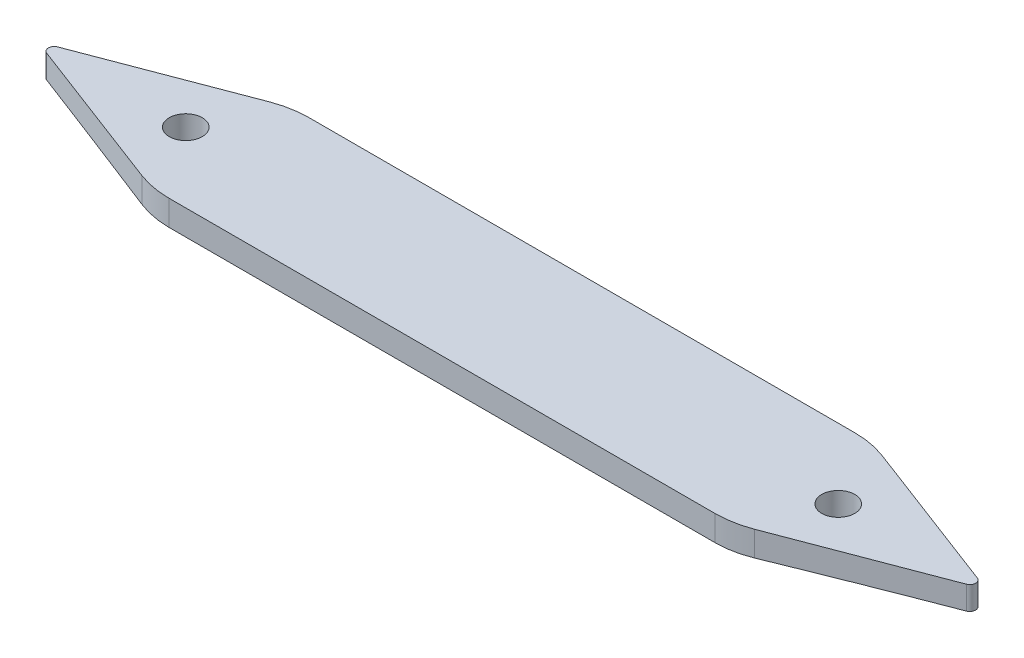
ISO-10303-21;
HEADER;
FILE_DESCRIPTION(('STEP AP214'),'2;1');
FILE_NAME('part.step','',(''),(''),'','','');
FILE_SCHEMA(('AUTOMOTIVE_DESIGN { 1 0 10303 214 1 1 1 1 }'));
ENDSEC;
DATA;
#1=APPLICATION_CONTEXT('core data for automotive mechanical design processes');
#2=APPLICATION_PROTOCOL_DEFINITION('international standard','automotive_design',2000,#1);
#3=PRODUCT_CONTEXT('',#1,'mechanical');
#4=PRODUCT('Part','Part','',(#3));
#5=PRODUCT_RELATED_PRODUCT_CATEGORY('part','',(#4));
#6=PRODUCT_DEFINITION_FORMATION('','',#4);
#7=PRODUCT_DEFINITION_CONTEXT('part definition',#1,'design');
#8=PRODUCT_DEFINITION('design','',#6,#7);
#9=PRODUCT_DEFINITION_SHAPE('','',#8);
#10=(LENGTH_UNIT() NAMED_UNIT(*) SI_UNIT(.MILLI.,.METRE.));
#11=(NAMED_UNIT(*) PLANE_ANGLE_UNIT() SI_UNIT($,.RADIAN.));
#12=(NAMED_UNIT(*) SI_UNIT($,.STERADIAN.) SOLID_ANGLE_UNIT());
#13=UNCERTAINTY_MEASURE_WITH_UNIT(LENGTH_MEASURE(1.E-05),#10,'distance_accuracy_value','');
#14=(GEOMETRIC_REPRESENTATION_CONTEXT(3) GLOBAL_UNCERTAINTY_ASSIGNED_CONTEXT((#13)) GLOBAL_UNIT_ASSIGNED_CONTEXT((#10,
#11,#12)) REPRESENTATION_CONTEXT('',''));
#15=CARTESIAN_POINT('',(0.,0.,0.));
#16=DIRECTION('',(0.,0.,1.));
#17=DIRECTION('',(1.,0.,0.));
#18=AXIS2_PLACEMENT_3D('',#15,#16,#17);
#19=CARTESIAN_POINT('',(-62.3678648511801,-10.,0.));
#20=DIRECTION('',(0.,1.,0.));
#21=DIRECTION('',(0.,0.,1.));
#22=AXIS2_PLACEMENT_3D('',#19,#20,#21);
#23=CYLINDRICAL_SURFACE('',#22,0.793750000000001);
#24=DIRECTION('',(0.,1.,0.));
#25=VECTOR('',#24,1.);
#26=CARTESIAN_POINT('',(-62.6498189486751,-10.,0.741984467092001));
#27=LINE('',#26,#25);
#28=CARTESIAN_POINT('',(-62.6498189486751,-0.00163461129128704,0.741984467092001));
#29=VERTEX_POINT('',#28);
#30=CARTESIAN_POINT('',(-62.6498189486751,3.175,0.741984467092001));
#31=VERTEX_POINT('',#30);
#32=EDGE_CURVE('E142',#29,#31,#27,.T.);
#33=ORIENTED_EDGE('',*,*,#32,.T.);
#34=CARTESIAN_POINT('',(-62.3678648511801,3.175,0.));
#35=DIRECTION('',(0.,1.,0.));
#36=DIRECTION('',(0.,0.,1.));
#37=AXIS2_PLACEMENT_3D('',#34,#35,#36);
#38=CIRCLE('',#37,0.793750000000001);
#39=CARTESIAN_POINT('',(-62.6498189486751,3.175,-0.741984467092001));
#40=VERTEX_POINT('',#39);
#41=EDGE_CURVE('E50',#31,#40,#38,.F.);
#42=ORIENTED_EDGE('',*,*,#41,.T.);
#43=DIRECTION('',(0.,1.,0.));
#44=VECTOR('',#43,1.);
#45=CARTESIAN_POINT('',(-62.6498189486751,-10.,-0.741984467092001));
#46=LINE('',#45,#44);
#47=CARTESIAN_POINT('',(-62.6498189486751,-0.00163461129125929,-0.741984467092001));
#48=VERTEX_POINT('',#47);
#49=EDGE_CURVE('E42',#48,#40,#46,.T.);
#50=ORIENTED_EDGE('',*,*,#49,.F.);
#51=CARTESIAN_POINT('',(-62.6498189486751,-0.00163461129129572,-0.741984467092001));
#52=CARTESIAN_POINT('',(-62.6915741219466,-0.00156508989525228,-0.726158063315236));
#53=CARTESIAN_POINT('',(-62.7319540446865,-0.00148155707035045,-0.706744537786753));
#54=CARTESIAN_POINT('',(-62.8088737758457,-0.00129747886939431,-0.661456213203216));
#55=CARTESIAN_POINT('',(-62.8454163621534,-0.00119694593945092,-0.635586134570223));
#56=CARTESIAN_POINT('',(-62.9136515843527,-0.00098969656053813,-0.578059238876378));
#57=CARTESIAN_POINT('',(-62.9453419646321,-0.000882977267342816,-0.546399745444655));
#58=CARTESIAN_POINT('',(-63.0029529930304,-0.000675561471225153,-0.478218111195962));
#59=CARTESIAN_POINT('',(-63.0288747805474,-0.000574863781809217,-0.441696932928466));
#60=CARTESIAN_POINT('',(-63.0742198858723,-0.000390787216427163,-0.36481984003851));
#61=CARTESIAN_POINT('',(-63.0936430437366,-0.000307408766739843,-0.324463831064908));
#62=CARTESIAN_POINT('',(-63.125441558766,-0.000167369911612684,-0.241057601110135));
#63=CARTESIAN_POINT('',(-63.1378158399757,-0.00011071358532191,-0.198006969928573));
#64=CARTESIAN_POINT('',(-63.1551600375871,-3.05267496641538E-05,-0.110441728920832));
#65=CARTESIAN_POINT('',(-63.1601303884779,-6.99429647416766E-06,-0.0659272051578151));
#66=CARTESIAN_POINT('',(-63.1625269602261,4.29703752498706E-06,0.0233021506023194));
#67=CARTESIAN_POINT('',(-63.159953570562,-7.94223479437769E-06,0.0680169721391791));
#68=CARTESIAN_POINT('',(-63.1473362532705,-6.68119844042359E-05,0.15638230282722));
#69=CARTESIAN_POINT('',(-63.1372919278762,-0.000113444292844494,0.200032755181551));
#70=CARTESIAN_POINT('',(-63.1100182199976,-0.000235840348066786,0.285024774146865));
#71=CARTESIAN_POINT('',(-63.0927893366819,-0.000311602070967512,0.3263665009372));
#72=CARTESIAN_POINT('',(-63.0516403628097,-0.000483699055612537,0.40556284544066));
#73=CARTESIAN_POINT('',(-63.0277215993205,-0.000580030236110841,0.443418152774899));
#74=CARTESIAN_POINT('',(-62.9738548715119,-0.000782468520473837,0.514594482151192));
#75=CARTESIAN_POINT('',(-62.9439040425362,-0.000888580256135629,0.547913337162356));
#76=CARTESIAN_POINT('',(-62.878812249009,-0.00109865913856934,0.609072578464356));
#77=CARTESIAN_POINT('',(-62.8436669514175,-0.001202624411518,0.636908345297608));
#78=CARTESIAN_POINT('',(-62.7692513136541,-0.00139636974883372,0.686230536853314));
#79=CARTESIAN_POINT('',(-62.7299899315296,-0.00148617959541336,0.707730377249736));
#80=CARTESIAN_POINT('',(-62.6762519654495,-0.00158879578078354,0.73153329892461));
#81=CARTESIAN_POINT('',(-62.6631005574963,-0.00161239795515977,0.736940088182253));
#82=CARTESIAN_POINT('',(-62.6498189486751,-0.00163461129127525,0.741984467091999));
#83=B_SPLINE_CURVE_WITH_KNOTS('',3,(#51,#52,#53,#54,#55,#56,#57,#58,#59,#60,#61,#62,#63,#64,#65,
#66,#67,#68,#69,#70,#71,#72,#73,#74,#75,#76,#77,#78,#79,#80,#81,#82),.UNSPECIFIED.,.F.,.F.,(4,2,
2,2,2,2,2,2,2,2,2,2,2,2,2,4),(0.,0.133783822944755,0.267470120852814,0.401218377148128,
0.534940192327704,0.668665298415121,0.802410811123229,0.936148474856556,1.06987923392123,
1.20361711357643,1.33734570294199,1.47104778344296,1.60481351005397,1.73869145567992,
1.87228385745369,1.91491974103122),.UNSPECIFIED.);
#84=EDGE_CURVE('E146',#48,#29,#83,.T.);
#85=ORIENTED_EDGE('',*,*,#84,.T.);
#86=EDGE_LOOP('',(#33,#42,#50,#85));
#87=FACE_BOUND('',#86,.T.);
#88=ADVANCED_FACE('F33',(#87),#23,.T.);
#89=CARTESIAN_POINT('',(-37.2049560035451,-10.,3.17500000000001));
#90=DIRECTION('',(0.,1.,0.));
#91=DIRECTION('',(0.,0.,1.));
#92=AXIS2_PLACEMENT_3D('',#89,#90,#91);
#93=CYLINDRICAL_SURFACE('',#92,12.7);
#94=DIRECTION('',(0.,1.,0.));
#95=VECTOR('',#94,1.);
#96=CARTESIAN_POINT('',(-41.7162215634645,-10.,-8.69675147347203));
#97=LINE('',#96,#95);
#98=CARTESIAN_POINT('',(-41.7162215634645,-0.22471224149001,-8.69675147347203));
#99=VERTEX_POINT('',#98);
#100=CARTESIAN_POINT('',(-41.7162215634645,3.175,-8.69675147347203));
#101=VERTEX_POINT('',#100);
#102=EDGE_CURVE('E200',#99,#101,#97,.T.);
#103=ORIENTED_EDGE('',*,*,#102,.T.);
#104=CARTESIAN_POINT('',(-37.2049560035451,3.175,3.17500000000001));
#105=DIRECTION('',(0.,1.,0.));
#106=DIRECTION('',(0.,0.,1.));
#107=AXIS2_PLACEMENT_3D('',#104,#105,#106);
#108=CIRCLE('',#107,12.7);
#109=CARTESIAN_POINT('',(-37.2049560035451,3.175,-9.525));
#110=VERTEX_POINT('',#109);
#111=EDGE_CURVE('E246',#101,#110,#108,.F.);
#112=ORIENTED_EDGE('',*,*,#111,.T.);
#113=DIRECTION('',(0.,1.,0.));
#114=VECTOR('',#113,1.);
#115=CARTESIAN_POINT('',(-37.2049560035451,-10.,-9.52499999999999));
#116=LINE('',#115,#114);
#117=CARTESIAN_POINT('',(-37.2049560035451,-0.269587958181022,-9.52500000000001));
#118=VERTEX_POINT('',#117);
#119=EDGE_CURVE('E203',#118,#110,#116,.T.);
#120=ORIENTED_EDGE('',*,*,#119,.F.);
#121=CARTESIAN_POINT('',(-37.2049560035451,-0.269587958180995,-9.525));
#122=CARTESIAN_POINT('',(-37.3979412096529,-0.269588539962104,-9.52500038932654));
#123=CARTESIAN_POINT('',(-37.590901687739,-0.269338658257018,-9.52060058943539));
#124=CARTESIAN_POINT('',(-37.9764192947636,-0.268343613325888,-9.503015716948));
#125=CARTESIAN_POINT('',(-38.1689764264833,-0.267598453526247,-9.48983070512908));
#126=CARTESIAN_POINT('',(-38.7422700961615,-0.264645240343936,-9.43741717424379));
#127=CARTESIAN_POINT('',(-39.1219001718408,-0.261719202526182,-9.38532840618097));
#128=CARTESIAN_POINT('',(-39.8748848942764,-0.254059366661241,-9.24707731345254));
#129=CARTESIAN_POINT('',(-40.2482395495386,-0.249325571064576,-9.16091503497556));
#130=CARTESIAN_POINT('',(-40.8027098721836,-0.240995926584404,-9.00627383709047));
#131=CARTESIAN_POINT('',(-40.9873708969754,-0.237999325829147,-8.95020374637864));
#132=CARTESIAN_POINT('',(-41.3539426171255,-0.231629868310424,-8.82971275025547));
#133=CARTESIAN_POINT('',(-41.5358532980001,-0.228257009566296,-8.76529180088406));
#134=CARTESIAN_POINT('',(-41.7162215634645,-0.224712241490016,-8.69675147347203));
#135=B_SPLINE_CURVE_WITH_KNOTS('',3,(#121,#122,#123,#124,#125,#126,#127,#128,#129,#130,#131,
#132,#133,#134),.UNSPECIFIED.,.F.,.F.,(4,2,2,2,2,2,4),(0.,0.578855974469045,1.1577079443725,
2.30563518188885,3.45356086332791,4.03241225481911,4.61126669358702),.UNSPECIFIED.);
#136=EDGE_CURVE('E192',#118,#99,#135,.T.);
#137=ORIENTED_EDGE('',*,*,#136,.T.);
#138=EDGE_LOOP('',(#103,#112,#120,#137));
#139=FACE_BOUND('',#138,.T.);
#140=ADVANCED_FACE('F178',(#139),#93,.T.);
#141=CARTESIAN_POINT('',(37.2049560035452,-10.,-9.525));
#142=DIRECTION('',(0.,0.,-1.));
#143=DIRECTION('',(-1.,0.,0.));
#144=AXIS2_PLACEMENT_3D('',#141,#142,#143);
#145=PLANE('',#144);
#146=ORIENTED_EDGE('',*,*,#119,.T.);
#147=DIRECTION('',(1.,0.,0.));
#148=VECTOR('',#147,1.);
#149=CARTESIAN_POINT('',(37.2049560035452,3.175,-9.525));
#150=LINE('',#149,#148);
#151=CARTESIAN_POINT('',(37.2049560035452,3.175,-9.525));
#152=VERTEX_POINT('',#151);
#153=EDGE_CURVE('E255',#110,#152,#150,.T.);
#154=ORIENTED_EDGE('',*,*,#153,.T.);
#155=DIRECTION('',(0.,1.,0.));
#156=VECTOR('',#155,1.);
#157=CARTESIAN_POINT('',(37.2049560035452,-10.,-9.525));
#158=LINE('',#157,#156);
#159=CARTESIAN_POINT('',(37.2049560035452,-0.269587958180995,-9.525));
#160=VERTEX_POINT('',#159);
#161=EDGE_CURVE('E206',#160,#152,#158,.T.);
#162=ORIENTED_EDGE('',*,*,#161,.F.);
#163=DIRECTION('',(-1.,0.,0.));
#164=VECTOR('',#163,1.);
#165=CARTESIAN_POINT('',(94.675,-0.269587958181022,-9.52500000000001));
#166=LINE('',#165,#164);
#167=EDGE_CURVE('E310',#160,#118,#166,.T.);
#168=ORIENTED_EDGE('',*,*,#167,.T.);
#169=EDGE_LOOP('',(#146,#154,#162,#168));
#170=FACE_BOUND('',#169,.T.);
#171=ADVANCED_FACE('F183',(#170),#145,.T.);
#172=CARTESIAN_POINT('',(37.2049560035452,-10.,3.17500000000002));
#173=DIRECTION('',(0.,1.,0.));
#174=DIRECTION('',(0.,0.,1.));
#175=AXIS2_PLACEMENT_3D('',#172,#173,#174);
#176=CYLINDRICAL_SURFACE('',#175,12.7);
#177=ORIENTED_EDGE('',*,*,#161,.T.);
#178=CARTESIAN_POINT('',(37.2049560035452,3.175,3.17500000000002));
#179=DIRECTION('',(0.,1.,0.));
#180=DIRECTION('',(0.,0.,1.));
#181=AXIS2_PLACEMENT_3D('',#178,#179,#180);
#182=CIRCLE('',#181,12.7);
#183=CARTESIAN_POINT('',(41.7162215634645,3.175,-8.69675147347204));
#184=VERTEX_POINT('',#183);
#185=EDGE_CURVE('E252',#152,#184,#182,.F.);
#186=ORIENTED_EDGE('',*,*,#185,.T.);
#187=DIRECTION('',(0.,1.,0.));
#188=VECTOR('',#187,1.);
#189=CARTESIAN_POINT('',(41.7162215634645,-10.,-8.69675147347204));
#190=LINE('',#189,#188);
#191=CARTESIAN_POINT('',(41.7162215634645,-0.224712241490002,-8.69675147347204));
#192=VERTEX_POINT('',#191);
#193=EDGE_CURVE('E209',#192,#184,#190,.T.);
#194=ORIENTED_EDGE('',*,*,#193,.F.);
#195=CARTESIAN_POINT('',(41.7162215634645,-0.22471224149001,-8.69675147347204));
#196=CARTESIAN_POINT('',(41.5358532980001,-0.228257009566279,-8.76529180088407));
#197=CARTESIAN_POINT('',(41.3539426171255,-0.231629868310412,-8.82971275025548));
#198=CARTESIAN_POINT('',(40.9873708969754,-0.237999325829152,-8.95020374637865));
#199=CARTESIAN_POINT('',(40.8027098721837,-0.240995926584421,-9.00627383709048));
#200=CARTESIAN_POINT('',(40.2482395495387,-0.249325571064599,-9.16091503497557));
#201=CARTESIAN_POINT('',(39.8748848942764,-0.25405936666123,-9.24707731345255));
#202=CARTESIAN_POINT('',(39.1219001718409,-0.261719202526168,-9.38532840618098));
#203=CARTESIAN_POINT('',(38.7422700961615,-0.264645240343954,-9.43741717424379));
#204=CARTESIAN_POINT('',(38.1689764264833,-0.267598453526255,-9.48983070512909));
#205=CARTESIAN_POINT('',(37.9764192947636,-0.268343613325883,-9.50301571694801));
#206=CARTESIAN_POINT('',(37.590901687739,-0.269338658256994,-9.5206005894354));
#207=CARTESIAN_POINT('',(37.3979412096529,-0.269588539962073,-9.52500038932654));
#208=CARTESIAN_POINT('',(37.2049560035452,-0.269587958180975,-9.525));
#209=B_SPLINE_CURVE_WITH_KNOTS('',3,(#195,#196,#197,#198,#199,#200,#201,#202,#203,#204,#205,
#206,#207,#208),.UNSPECIFIED.,.F.,.F.,(4,2,2,2,2,2,4),(0.,0.578854438767908,1.15770583025911,
2.30563151169816,3.45355874921451,4.03241071911796,4.61126669358701),.UNSPECIFIED.);
#210=EDGE_CURVE('E303',#192,#160,#209,.T.);
#211=ORIENTED_EDGE('',*,*,#210,.T.);
#212=EDGE_LOOP('',(#177,#186,#194,#211));
#213=FACE_BOUND('',#212,.T.);
#214=ADVANCED_FACE('F311',(#213),#176,.T.);
#215=CARTESIAN_POINT('',(62.3678648511801,-10.,0.));
#216=DIRECTION('',(0.,1.,0.));
#217=DIRECTION('',(0.,0.,1.));
#218=AXIS2_PLACEMENT_3D('',#215,#216,#217);
#219=CYLINDRICAL_SURFACE('',#218,0.793750000000015);
#220=DIRECTION('',(0.,1.,0.));
#221=VECTOR('',#220,1.);
#222=CARTESIAN_POINT('',(62.6498189486751,-10.,-0.741984467092032));
#223=LINE('',#222,#221);
#224=CARTESIAN_POINT('',(62.6498189486751,-0.00163461129129572,-0.741984467092032));
#225=VERTEX_POINT('',#224);
#226=CARTESIAN_POINT('',(62.6498189486751,3.175,-0.741984467092032));
#227=VERTEX_POINT('',#226);
#228=EDGE_CURVE('E212',#225,#227,#223,.T.);
#229=ORIENTED_EDGE('',*,*,#228,.T.);
#230=CARTESIAN_POINT('',(62.3678648511801,3.175,0.));
#231=DIRECTION('',(0.,1.,0.));
#232=DIRECTION('',(0.,0.,1.));
#233=AXIS2_PLACEMENT_3D('',#230,#231,#232);
#234=CIRCLE('',#233,0.793750000000015);
#235=CARTESIAN_POINT('',(62.6498189486751,3.175,0.741984467092015));
#236=VERTEX_POINT('',#235);
#237=EDGE_CURVE('E243',#227,#236,#234,.F.);
#238=ORIENTED_EDGE('',*,*,#237,.T.);
#239=DIRECTION('',(0.,1.,0.));
#240=VECTOR('',#239,1.);
#241=CARTESIAN_POINT('',(62.6498189486751,-10.,0.741984467092017));
#242=LINE('',#241,#240);
#243=CARTESIAN_POINT('',(62.6498189486751,-0.00163461129128704,0.741984467092017));
#244=VERTEX_POINT('',#243);
#245=EDGE_CURVE('E215',#244,#236,#242,.T.);
#246=ORIENTED_EDGE('',*,*,#245,.F.);
#247=CARTESIAN_POINT('',(62.6498189486751,-0.00163461129129572,0.741984467092003));
#248=CARTESIAN_POINT('',(62.6915741219466,-0.00156508989525963,0.726158063315237));
#249=CARTESIAN_POINT('',(62.7319540446866,-0.00148155707036006,0.706744537786751));
#250=CARTESIAN_POINT('',(62.8088737758457,-0.00129747886940248,0.661456213203209));
#251=CARTESIAN_POINT('',(62.8454163621535,-0.00119694593945539,0.635586134570215));
#252=CARTESIAN_POINT('',(62.9136515843527,-0.000989696560533371,0.578059238876365));
#253=CARTESIAN_POINT('',(62.9453419646321,-0.000882977267332525,0.546399745444639));
#254=CARTESIAN_POINT('',(63.0029529930305,-0.000675561471217082,0.478218111195939));
#255=CARTESIAN_POINT('',(63.0288747805475,-0.000574863781808893,0.441696932928439));
#256=CARTESIAN_POINT('',(63.0742198858724,-0.000390787216426975,0.364819840038479));
#257=CARTESIAN_POINT('',(63.0936430437366,-0.00030740876673204,0.324463831064876));
#258=CARTESIAN_POINT('',(63.1254415587661,-0.000167369911632142,0.241057601110107));
#259=CARTESIAN_POINT('',(63.1378158399758,-0.000110713585376251,0.198006969928549));
#260=CARTESIAN_POINT('',(63.1551600375871,-3.05267497203485E-05,0.11044172892081));
#261=CARTESIAN_POINT('',(63.1601303884779,-6.99429649733868E-06,0.0659272051577906));
#262=CARTESIAN_POINT('',(63.1625269602261,4.29703753774797E-06,-0.0233021506023483));
#263=CARTESIAN_POINT('',(63.159953570562,-7.94223477870745E-06,-0.0680169721392098));
#264=CARTESIAN_POINT('',(63.1473362532705,-6.68119844194782E-05,-0.156382302827251));
#265=CARTESIAN_POINT('',(63.1372919278762,-0.00011344429289356,-0.200032755181581));
#266=CARTESIAN_POINT('',(63.1100182199976,-0.000235840348114319,-0.285024774146897));
#267=CARTESIAN_POINT('',(63.092789336682,-0.000311602070979693,-0.326366500937236));
#268=CARTESIAN_POINT('',(63.0516403628097,-0.000483699055600099,-0.405562845440694));
#269=CARTESIAN_POINT('',(63.0277215993205,-0.000580030236109127,-0.443418152774929));
#270=CARTESIAN_POINT('',(62.9738548715119,-0.000782468520479091,-0.514594482151221));
#271=CARTESIAN_POINT('',(62.9439040425362,-0.000888580256137118,-0.547913337162389));
#272=CARTESIAN_POINT('',(62.878812249009,-0.00109865913856781,-0.609072578464397));
#273=CARTESIAN_POINT('',(62.8436669514175,-0.00120262441151722,-0.636908345297651));
#274=CARTESIAN_POINT('',(62.7692513136541,-0.00139636974883374,-0.686230536853356));
#275=CARTESIAN_POINT('',(62.7299899315297,-0.00148617959541345,-0.707730377249776));
#276=CARTESIAN_POINT('',(62.6762519654495,-0.00158879578078365,-0.731533298924645));
#277=CARTESIAN_POINT('',(62.6631005574963,-0.00161239795515986,-0.736940088182286));
#278=CARTESIAN_POINT('',(62.6498189486751,-0.00163461129127535,-0.741984467092029));
#279=B_SPLINE_CURVE_WITH_KNOTS('',3,(#247,#248,#249,#250,#251,#252,#253,#254,#255,#256,#257,
#258,#259,#260,#261,#262,#263,#264,#265,#266,#267,#268,#269,#270,#271,#272,#273,#274,#275,#276,
#277,#278),.UNSPECIFIED.,.F.,.F.,(4,2,2,2,2,2,2,2,2,2,2,2,2,2,2,4),(0.,0.133783822944771,
0.267470120852831,0.401218377148165,0.534940192327748,0.668665298415158,0.802410811123262,
0.936148474856592,1.06987923392127,1.20361711357647,1.33734570294203,1.47104778344301,
1.60481351005402,1.73869145568,1.87228385745375,1.91491974103127),.UNSPECIFIED.);
#280=EDGE_CURVE('E294',#244,#225,#279,.T.);
#281=ORIENTED_EDGE('',*,*,#280,.T.);
#282=EDGE_LOOP('',(#229,#238,#246,#281));
#283=FACE_BOUND('',#282,.T.);
#284=ADVANCED_FACE('F283',(#283),#219,.T.);
#285=CARTESIAN_POINT('',(37.2049560035452,-10.,-3.17500000000002));
#286=DIRECTION('',(0.,1.,0.));
#287=DIRECTION('',(0.,0.,1.));
#288=AXIS2_PLACEMENT_3D('',#285,#286,#287);
#289=CYLINDRICAL_SURFACE('',#288,12.7);
#290=DIRECTION('',(0.,1.,0.));
#291=VECTOR('',#290,1.);
#292=CARTESIAN_POINT('',(41.7162215634645,-10.,8.69675147347204));
#293=LINE('',#292,#291);
#294=CARTESIAN_POINT('',(41.7162215634645,-0.22471224149001,8.69675147347204));
#295=VERTEX_POINT('',#294);
#296=CARTESIAN_POINT('',(41.7162215634645,3.175,8.69675147347204));
#297=VERTEX_POINT('',#296);
#298=EDGE_CURVE('E218',#295,#297,#293,.T.);
#299=ORIENTED_EDGE('',*,*,#298,.T.);
#300=CARTESIAN_POINT('',(37.2049560035452,3.175,-3.17500000000002));
#301=DIRECTION('',(0.,1.,0.));
#302=DIRECTION('',(0.,0.,1.));
#303=AXIS2_PLACEMENT_3D('',#300,#301,#302);
#304=CIRCLE('',#303,12.7);
#305=CARTESIAN_POINT('',(37.2049560035452,3.175,9.525));
#306=VERTEX_POINT('',#305);
#307=EDGE_CURVE('E232',#297,#306,#304,.F.);
#308=ORIENTED_EDGE('',*,*,#307,.T.);
#309=DIRECTION('',(0.,1.,0.));
#310=VECTOR('',#309,1.);
#311=CARTESIAN_POINT('',(37.2049560035452,-10.,9.525));
#312=LINE('',#311,#310);
#313=CARTESIAN_POINT('',(37.2049560035452,-0.269587958181022,9.52500000000001));
#314=VERTEX_POINT('',#313);
#315=EDGE_CURVE('E144',#314,#306,#312,.T.);
#316=ORIENTED_EDGE('',*,*,#315,.F.);
#317=CARTESIAN_POINT('',(37.2049560035452,-0.269587958180995,9.525));
#318=CARTESIAN_POINT('',(37.3979412096529,-0.269588539962103,9.52500038932654));
#319=CARTESIAN_POINT('',(37.590901687739,-0.269338658257018,9.5206005894354));
#320=CARTESIAN_POINT('',(37.9764192947636,-0.268343613325887,9.50301571694801));
#321=CARTESIAN_POINT('',(38.1689764264833,-0.267598453526246,9.48983070512909));
#322=CARTESIAN_POINT('',(38.7422700961615,-0.264645240343935,9.43741717424379));
#323=CARTESIAN_POINT('',(39.1219001718409,-0.261719202526181,9.38532840618098));
#324=CARTESIAN_POINT('',(39.8748848942764,-0.25405936666124,9.24707731345255));
#325=CARTESIAN_POINT('',(40.2482395495387,-0.249325571064575,9.16091503497557));
#326=CARTESIAN_POINT('',(40.8027098721836,-0.240995926584403,9.00627383709048));
#327=CARTESIAN_POINT('',(40.9873708969754,-0.237999325829146,8.95020374637865));
#328=CARTESIAN_POINT('',(41.3539426171255,-0.231629868310422,8.82971275025548));
#329=CARTESIAN_POINT('',(41.5358532980001,-0.228257009566295,8.76529180088408));
#330=CARTESIAN_POINT('',(41.7162215634645,-0.224712241490014,8.69675147347204));
#331=B_SPLINE_CURVE_WITH_KNOTS('',3,(#317,#318,#319,#320,#321,#322,#323,#324,#325,#326,#327,
#328,#329,#330),.UNSPECIFIED.,.F.,.F.,(4,2,2,2,2,2,4),(0.,0.578855974469052,1.15770794437251,
2.30563518188884,3.4535608633279,4.03241225481911,4.61126669358701),.UNSPECIFIED.);
#332=EDGE_CURVE('E230',#314,#295,#331,.T.);
#333=ORIENTED_EDGE('',*,*,#332,.T.);
#334=EDGE_LOOP('',(#299,#308,#316,#333));
#335=FACE_BOUND('',#334,.T.);
#336=ADVANCED_FACE('F229',(#335),#289,.T.);
#337=CARTESIAN_POINT('',(37.2049560035452,-10.,9.525));
#338=DIRECTION('',(0.,0.,1.));
#339=DIRECTION('',(1.,0.,0.));
#340=AXIS2_PLACEMENT_3D('',#337,#338,#339);
#341=PLANE('',#340);
#342=ORIENTED_EDGE('',*,*,#315,.T.);
#343=DIRECTION('',(-1.,0.,0.));
#344=VECTOR('',#343,1.);
#345=CARTESIAN_POINT('',(37.2049560035452,3.175,9.525));
#346=LINE('',#345,#344);
#347=CARTESIAN_POINT('',(-37.2049560035451,3.175,9.525));
#348=VERTEX_POINT('',#347);
#349=EDGE_CURVE('E139',#306,#348,#346,.T.);
#350=ORIENTED_EDGE('',*,*,#349,.T.);
#351=DIRECTION('',(0.,1.,0.));
#352=VECTOR('',#351,1.);
#353=CARTESIAN_POINT('',(-37.2049560035451,-10.,9.525));
#354=LINE('',#353,#352);
#355=CARTESIAN_POINT('',(-37.2049560035451,-0.269587958180995,9.525));
#356=VERTEX_POINT('',#355);
#357=EDGE_CURVE('E138',#356,#348,#354,.T.);
#358=ORIENTED_EDGE('',*,*,#357,.F.);
#359=DIRECTION('',(-1.,0.,0.));
#360=VECTOR('',#359,1.);
#361=CARTESIAN_POINT('',(94.675,-0.269587958181022,9.52500000000001));
#362=LINE('',#361,#360);
#363=EDGE_CURVE('E225',#356,#314,#362,.F.);
#364=ORIENTED_EDGE('',*,*,#363,.T.);
#365=EDGE_LOOP('',(#342,#350,#358,#364));
#366=FACE_BOUND('',#365,.T.);
#367=ADVANCED_FACE('F224',(#366),#341,.T.);
#368=CARTESIAN_POINT('',(-37.2049560035451,-10.,-3.17500000000001));
#369=DIRECTION('',(0.,1.,0.));
#370=DIRECTION('',(0.,0.,1.));
#371=AXIS2_PLACEMENT_3D('',#368,#369,#370);
#372=CYLINDRICAL_SURFACE('',#371,12.7);
#373=ORIENTED_EDGE('',*,*,#357,.T.);
#374=CARTESIAN_POINT('',(-37.2049560035451,3.175,-3.17500000000001));
#375=DIRECTION('',(0.,1.,0.));
#376=DIRECTION('',(0.,0.,1.));
#377=AXIS2_PLACEMENT_3D('',#374,#375,#376);
#378=CIRCLE('',#377,12.7);
#379=CARTESIAN_POINT('',(-41.7162215634645,3.175,8.69675147347203));
#380=VERTEX_POINT('',#379);
#381=EDGE_CURVE('E124',#348,#380,#378,.F.);
#382=ORIENTED_EDGE('',*,*,#381,.T.);
#383=DIRECTION('',(0.,1.,0.));
#384=VECTOR('',#383,1.);
#385=CARTESIAN_POINT('',(-41.7162215634645,-10.,8.69675147347203));
#386=LINE('',#385,#384);
#387=CARTESIAN_POINT('',(-41.7162215634645,-0.224712241490002,8.69675147347203));
#388=VERTEX_POINT('',#387);
#389=EDGE_CURVE('E136',#388,#380,#386,.T.);
#390=ORIENTED_EDGE('',*,*,#389,.F.);
#391=CARTESIAN_POINT('',(-41.7162215634645,-0.22471224149001,8.69675147347203));
#392=CARTESIAN_POINT('',(-41.5358532980001,-0.22825700956628,8.76529180088406));
#393=CARTESIAN_POINT('',(-41.3539426171255,-0.231629868310412,8.82971275025546));
#394=CARTESIAN_POINT('',(-40.9873708969754,-0.237999325829152,8.95020374637864));
#395=CARTESIAN_POINT('',(-40.8027098721836,-0.24099592658442,9.00627383709047));
#396=CARTESIAN_POINT('',(-40.2482395495386,-0.249325571064599,9.16091503497556));
#397=CARTESIAN_POINT('',(-39.8748848942764,-0.254059366661233,9.24707731345254));
#398=CARTESIAN_POINT('',(-39.1219001718409,-0.261719202526163,9.38532840618097));
#399=CARTESIAN_POINT('',(-38.7422700961615,-0.264645240343937,9.43741717424378));
#400=CARTESIAN_POINT('',(-38.1689764264833,-0.267598453526261,9.48983070512908));
#401=CARTESIAN_POINT('',(-37.9764192947636,-0.268343613325904,9.503015716948));
#402=CARTESIAN_POINT('',(-37.590901687739,-0.269338658257025,9.5206005894354));
#403=CARTESIAN_POINT('',(-37.3979412096529,-0.269588539962101,9.52500038932654));
#404=CARTESIAN_POINT('',(-37.2049560035451,-0.269587958180973,9.525));
#405=B_SPLINE_CURVE_WITH_KNOTS('',3,(#391,#392,#393,#394,#395,#396,#397,#398,#399,#400,#401,
#402,#403,#404),.UNSPECIFIED.,.F.,.F.,(4,2,2,2,2,2,4),(0.,0.578854438767908,1.15770583025911,
2.30563151169816,3.45355874921451,4.03241071911795,4.61126669358701),.UNSPECIFIED.);
#406=EDGE_CURVE('E58',#388,#356,#405,.T.);
#407=ORIENTED_EDGE('',*,*,#406,.T.);
#408=EDGE_LOOP('',(#373,#382,#390,#407));
#409=FACE_BOUND('',#408,.T.);
#410=ADVANCED_FACE('F135',(#409),#372,.T.);
#411=CARTESIAN_POINT('',(-41.7162215634645,-10.,-8.69675147347203));
#412=DIRECTION('',(-0.355217760623573,0.,-0.934783580588349));
#413=DIRECTION('',(-0.934783580588349,0.,0.355217760623573));
#414=AXIS2_PLACEMENT_3D('',#411,#412,#413);
#415=PLANE('',#414);
#416=ORIENTED_EDGE('',*,*,#49,.T.);
#417=DIRECTION('',(0.934783580588349,0.,-0.355217760623573));
#418=VECTOR('',#417,1.);
#419=CARTESIAN_POINT('',(-41.7162215634645,3.175,-8.69675147347203));
#420=LINE('',#419,#418);
#421=EDGE_CURVE('E240',#40,#101,#420,.T.);
#422=ORIENTED_EDGE('',*,*,#421,.T.);
#423=ORIENTED_EDGE('',*,*,#102,.F.);
#424=CARTESIAN_POINT('',(-64.6024096515487,-168.402,0.));
#425=DIRECTION('',(-0.355217760623573,0.,-0.934783580588349));
#426=DIRECTION('',(-0.934783580588349,0.,0.355217760623573));
#427=AXIS2_PLACEMENT_3D('',#424,#425,#426);
#428=ELLIPSE('',#427,474.081024846212,168.402);
#429=EDGE_CURVE('E190',#99,#48,#428,.F.);
#430=ORIENTED_EDGE('',*,*,#429,.T.);
#431=EDGE_LOOP('',(#416,#422,#423,#430));
#432=FACE_BOUND('',#431,.T.);
#433=ADVANCED_FACE('F267',(#432),#415,.T.);
#434=CARTESIAN_POINT('',(41.7162215634645,-10.,-8.69675147347204));
#435=DIRECTION('',(0.355217760623573,0.,-0.934783580588349));
#436=DIRECTION('',(-0.934783580588349,0.,-0.355217760623573));
#437=AXIS2_PLACEMENT_3D('',#434,#435,#436);
#438=PLANE('',#437);
#439=ORIENTED_EDGE('',*,*,#193,.T.);
#440=DIRECTION('',(0.934783580588349,0.,0.355217760623573));
#441=VECTOR('',#440,1.);
#442=CARTESIAN_POINT('',(41.7162215634645,3.175,-8.69675147347204));
#443=LINE('',#442,#441);
#444=EDGE_CURVE('E249',#184,#227,#443,.T.);
#445=ORIENTED_EDGE('',*,*,#444,.T.);
#446=ORIENTED_EDGE('',*,*,#228,.F.);
#447=CARTESIAN_POINT('',(64.6024096515488,-168.402,0.));
#448=DIRECTION('',(0.355217760623573,0.,-0.934783580588349));
#449=DIRECTION('',(-0.934783580588349,0.,-0.355217760623573));
#450=AXIS2_PLACEMENT_3D('',#447,#448,#449);
#451=ELLIPSE('',#450,474.081024846213,168.402);
#452=EDGE_CURVE('E300',#225,#192,#451,.F.);
#453=ORIENTED_EDGE('',*,*,#452,.T.);
#454=EDGE_LOOP('',(#439,#445,#446,#453));
#455=FACE_BOUND('',#454,.T.);
#456=ADVANCED_FACE('F274',(#455),#438,.T.);
#457=CARTESIAN_POINT('',(41.7162215634645,-10.,8.69675147347204));
#458=DIRECTION('',(0.355217760623573,0.,0.934783580588349));
#459=DIRECTION('',(0.934783580588349,0.,-0.355217760623573));
#460=AXIS2_PLACEMENT_3D('',#457,#458,#459);
#461=PLANE('',#460);
#462=ORIENTED_EDGE('',*,*,#245,.T.);
#463=DIRECTION('',(-0.934783580588349,0.,0.355217760623573));
#464=VECTOR('',#463,1.);
#465=CARTESIAN_POINT('',(41.7162215634645,3.175,8.69675147347204));
#466=LINE('',#465,#464);
#467=EDGE_CURVE('E235',#236,#297,#466,.T.);
#468=ORIENTED_EDGE('',*,*,#467,.T.);
#469=ORIENTED_EDGE('',*,*,#298,.F.);
#470=CARTESIAN_POINT('',(64.6024096515488,-168.402,0.));
#471=DIRECTION('',(0.355217760623573,0.,0.934783580588349));
#472=DIRECTION('',(-0.934783580588349,0.,0.355217760623573));
#473=AXIS2_PLACEMENT_3D('',#470,#471,#472);
#474=ELLIPSE('',#473,474.081024846213,168.402);
#475=EDGE_CURVE('E291',#295,#244,#474,.F.);
#476=ORIENTED_EDGE('',*,*,#475,.T.);
#477=EDGE_LOOP('',(#462,#468,#469,#476));
#478=FACE_BOUND('',#477,.T.);
#479=ADVANCED_FACE('F270',(#478),#461,.T.);
#480=CARTESIAN_POINT('',(-41.7162215634645,-10.,8.69675147347203));
#481=DIRECTION('',(-0.355217760623573,0.,0.934783580588349));
#482=DIRECTION('',(0.934783580588349,0.,0.355217760623573));
#483=AXIS2_PLACEMENT_3D('',#480,#481,#482);
#484=PLANE('',#483);
#485=ORIENTED_EDGE('',*,*,#389,.T.);
#486=DIRECTION('',(-0.934783580588349,0.,-0.355217760623573));
#487=VECTOR('',#486,1.);
#488=CARTESIAN_POINT('',(-41.7162215634645,3.175,8.69675147347203));
#489=LINE('',#488,#487);
#490=EDGE_CURVE('E120',#380,#31,#489,.T.);
#491=ORIENTED_EDGE('',*,*,#490,.T.);
#492=ORIENTED_EDGE('',*,*,#32,.F.);
#493=CARTESIAN_POINT('',(-64.6024096515487,-168.402,0.));
#494=DIRECTION('',(-0.355217760623573,0.,0.934783580588349));
#495=DIRECTION('',(-0.934783580588349,0.,-0.355217760623573));
#496=AXIS2_PLACEMENT_3D('',#493,#494,#495);
#497=ELLIPSE('',#496,474.081024846212,168.402);
#498=EDGE_CURVE('E11',#29,#388,#497,.F.);
#499=ORIENTED_EDGE('',*,*,#498,.T.);
#500=EDGE_LOOP('',(#485,#491,#492,#499));
#501=FACE_BOUND('',#500,.T.);
#502=ADVANCED_FACE('F141',(#501),#484,.T.);
#503=CARTESIAN_POINT('',(44.45,22.225,0.));
#504=DIRECTION('',(0.,1.,0.));
#505=DIRECTION('',(0.,0.,1.));
#506=AXIS2_PLACEMENT_3D('',#503,#504,#505);
#507=CYLINDRICAL_SURFACE('',#506,2.24789999999999);
#508=CARTESIAN_POINT('',(44.45,-0.0150036208555748,2.24789999999999));
#509=CARTESIAN_POINT('',(44.3237405050983,-0.0150034180278139,2.24789440286819));
#510=CARTESIAN_POINT('',(44.1973896033233,-0.0148600884913757,2.2372267353332));
#511=CARTESIAN_POINT('',(43.9481679834847,-0.0143021017935077,2.1948195583758));
#512=CARTESIAN_POINT('',(43.8253016333311,-0.0138871185474704,2.16305472390511));
#513=CARTESIAN_POINT('',(43.5866957509809,-0.0128328429337829,2.07935801725069));
#514=CARTESIAN_POINT('',(43.470952829234,-0.012193658233494,2.02743582387827));
#515=CARTESIAN_POINT('',(43.2498590978353,-0.010763141546152,1.90491169159793));
#516=CARTESIAN_POINT('',(43.1445057223168,-0.00997184726811415,1.83431438075254));
#517=CARTESIAN_POINT('',(42.9471271490788,-0.00832607456606143,1.67642510133721));
#518=CARTESIAN_POINT('',(42.855104090562,-0.00747158603401385,1.58913045844167));
#519=CARTESIAN_POINT('',(42.6870157649018,-0.00579582555366369,1.40032744809856));
#520=CARTESIAN_POINT('',(42.610951126178,-0.00497455491446157,1.29881852117526));
#521=CARTESIAN_POINT('',(42.4769417696796,-0.00345783925607471,1.08446850865324));
#522=CARTESIAN_POINT('',(42.4189973903858,-0.00276239658741986,0.971627211421339));
#523=CARTESIAN_POINT('',(42.3228759801344,-0.00157576357345944,0.737817310407469));
#524=CARTESIAN_POINT('',(42.2846989016133,-0.0010845727366903,0.616848726181902));
#525=CARTESIAN_POINT('',(42.2291978051322,-0.000361843624159826,0.37022550656742));
#526=CARTESIAN_POINT('',(42.2118725671119,-0.000130290156833715,0.244571145791138));
#527=CARTESIAN_POINT('',(42.1985632271729,4.71098953567384E-05,-0.00786271171986494));
#528=CARTESIAN_POINT('',(42.2025790775518,-7.04288115949944E-06,-0.134642205939021));
#529=CARTESIAN_POINT('',(42.2318367890042,-0.000394935939229786,-0.385719194623726));
#530=CARTESIAN_POINT('',(42.257077304584,-0.000728658498031594,-0.51001684590924));
#531=CARTESIAN_POINT('',(42.328065795526,-0.00163804910162759,-0.752610404498133));
#532=CARTESIAN_POINT('',(42.3738137971934,-0.00221371745676631,-0.87090630410283));
#533=CARTESIAN_POINT('',(42.4845201602281,-0.00354213219027383,-1.09814251202247));
#534=CARTESIAN_POINT('',(42.549479137765,-0.00429488424823501,-1.20708252011359));
#535=CARTESIAN_POINT('',(42.6967629842275,-0.00589260578394328,-1.41251115236646));
#536=CARTESIAN_POINT('',(42.7790878553759,-0.00673757527349338,-1.50899977493454));
#537=CARTESIAN_POINT('',(42.9587742187377,-0.00842455353853094,-1.6867945516401));
#538=CARTESIAN_POINT('',(43.0561368853409,-0.00926656207752317,-1.76809951890031));
#539=CARTESIAN_POINT('',(43.2631308750367,-0.0108526222442385,-1.91320986056964));
#540=CARTESIAN_POINT('',(43.3727621997991,-0.0115966738586286,-1.9770152325969));
#541=CARTESIAN_POINT('',(43.6011820426294,-0.0129029269315606,-2.08531499262179));
#542=CARTESIAN_POINT('',(43.7199705773015,-0.0134651280603519,-2.1298093456027));
#543=CARTESIAN_POINT('',(43.963332504911,-0.0143442797714789,-2.19822326174284));
#544=CARTESIAN_POINT('',(44.0879058945216,-0.0146612304948505,-2.22214283673399));
#545=CARTESIAN_POINT('',(44.3392909745921,-0.0150141229254054,-2.24872674753239));
#546=CARTESIAN_POINT('',(44.4661024915209,-0.0150500863235806,-2.25139272402476));
#547=CARTESIAN_POINT('',(44.7183730889616,-0.0148370060179716,-2.23539803152747));
#548=CARTESIAN_POINT('',(44.8438321697345,-0.0145879623692039,-2.21673736665462));
#549=CARTESIAN_POINT('',(45.0898319324471,-0.0138329648055354,-2.15862046601235));
#550=CARTESIAN_POINT('',(45.2103727898287,-0.0133270200634303,-2.11916497273187));
#551=CARTESIAN_POINT('',(45.4431196889008,-0.0121152684135857,-2.02057919412662));
#552=CARTESIAN_POINT('',(45.5553257281358,-0.0114094614469657,-1.96144890300554));
#553=CARTESIAN_POINT('',(45.7682253710182,-0.00987750492949157,-1.82518782499591));
#554=CARTESIAN_POINT('',(45.868918267753,-0.00905134799616469,-1.74805593368352));
#555=CARTESIAN_POINT('',(46.0559262011992,-0.0073718585083094,-1.57798278807686));
#556=CARTESIAN_POINT('',(46.1422412259876,-0.00651852593124585,-1.48504152067254));
#557=CARTESIAN_POINT('',(46.2980486367737,-0.00488082691975343,-1.28598091295947));
#558=CARTESIAN_POINT('',(46.3675399613365,-0.00409646483877359,-1.17986074181075));
#559=CARTESIAN_POINT('',(46.4877200206404,-0.00268519764205684,-0.957459102052565));
#560=CARTESIAN_POINT('',(46.5384087797025,-0.00205829232265102,-0.841177646586896));
#561=CARTESIAN_POINT('',(46.6195430241572,-0.00103263538156164,-0.601758275769575));
#562=CARTESIAN_POINT('',(46.649989204191,-0.00063387593092682,-0.478620595852182));
#563=CARTESIAN_POINT('',(46.6897763292674,-0.000109435015213625,-0.228980738173059));
#564=CARTESIAN_POINT('',(46.6991172474626,1.62461024884064E-05,-0.102478556131635));
#565=CARTESIAN_POINT('',(46.6964285329853,-1.96394350394766E-05,0.150288345875743));
#566=CARTESIAN_POINT('',(46.684400600162,-0.000181183242102648,0.276553083930064));
#567=CARTESIAN_POINT('',(46.6393190527931,-0.000773263531505953,0.525271131255683));
#568=CARTESIAN_POINT('',(46.6062653960711,-0.00120380055342984,0.647724432880959));
#569=CARTESIAN_POINT('',(46.5200703015695,-0.00228534503939302,0.885345758224835));
#570=CARTESIAN_POINT('',(46.4669284934754,-0.00293635656774033,1.00051364759502));
#571=CARTESIAN_POINT('',(46.3420680092974,-0.00438543530893174,1.22028890584224));
#572=CARTESIAN_POINT('',(46.2703500512132,-0.00518349683769922,1.32489668266846));
#573=CARTESIAN_POINT('',(46.1103750517851,-0.00683672098025382,1.52058577155998));
#574=CARTESIAN_POINT('',(46.0221184553471,-0.00769188205760796,1.61166744737276));
#575=CARTESIAN_POINT('',(45.8315410020796,-0.00936314744205794,1.77774451478817));
#576=CARTESIAN_POINT('',(45.7292166576606,-0.0101792419961703,1.85273590554413));
#577=CARTESIAN_POINT('',(45.5133861499951,-0.0116805155630162,1.98450655970692));
#578=CARTESIAN_POINT('',(45.3998742982232,-0.0123656274489284,2.04127649493045));
#579=CARTESIAN_POINT('',(45.1650186476636,-0.0135263148906014,2.13488791553124));
#580=CARTESIAN_POINT('',(45.0436844242596,-0.0140021412519975,2.17175326648785));
#581=CARTESIAN_POINT('',(44.8429818917615,-0.014562867635408,2.21469464291838));
#582=CARTESIAN_POINT('',(44.7649174330951,-0.014727436872036,2.22713108626667));
#583=CARTESIAN_POINT('',(44.6079139037613,-0.0149478769130045,2.24373551506315));
#584=CARTESIAN_POINT('',(44.5289748331439,-0.0150037477235667,2.24790350098461));
#585=CARTESIAN_POINT('',(44.45,-0.0150036208555748,2.24789999999999));
#586=B_SPLINE_CURVE_WITH_KNOTS('',3,(#508,#509,#510,#511,#512,#513,#514,#515,#516,#517,#518,
#519,#520,#521,#522,#523,#524,#525,#526,#527,#528,#529,#530,#531,#532,#533,#534,#535,#536,#537,
#538,#539,#540,#541,#542,#543,#544,#545,#546,#547,#548,#549,#550,#551,#552,#553,#554,#555,#556,
#557,#558,#559,#560,#561,#562,#563,#564,#565,#566,#567,#568,#569,#570,#571,#572,#573,#574,#575,
#576,#577,#578,#579,#580,#581,#582,#583,#584,#585),.UNSPECIFIED.,.T.,.F.,(4,2,2,2,2,2,2,2,2,2,2,
2,2,2,2,2,2,2,2,2,2,2,2,2,2,2,2,2,2,2,2,2,2,2,2,2,2,2,4),(0.,0.378490224709308,
0.757435612398643,1.13619926925721,1.51486914880233,1.893599728812,2.27234521988957,
2.65109778539347,3.02984943955101,3.40857893152676,3.78730757695501,4.16601221547515,
4.54471733976225,4.92343461188689,5.30215193248401,5.68089884430935,6.05964580768612,
6.43839345784306,6.81714089019368,7.19585908461093,7.57457720592217,7.95328180584432,
8.33198651733506,8.71071446901031,9.08944273475024,9.46819488885571,9.84694655304613,
10.2256852193847,10.6044243675074,10.9831333890382,11.3618431702384,11.7405599330938,
12.119262060086,12.4979540010758,12.8767399949105,13.2557195940441,13.6342437821698,
13.870987989623,14.1077321835253),.UNSPECIFIED.);
#587=CARTESIAN_POINT('',(44.45,-0.0150036208555748,2.24789999999999));
#588=VERTEX_POINT('',#587);
#589=EDGE_CURVE('E150',#588,#588,#586,.T.);
#590=ORIENTED_EDGE('',*,*,#589,.T.);
#591=EDGE_LOOP('',(#590));
#592=FACE_BOUND('',#591,.T.);
#593=CARTESIAN_POINT('',(44.45,3.175,0.));
#594=DIRECTION('',(0.,1.,0.));
#595=DIRECTION('',(0.,0.,1.));
#596=AXIS2_PLACEMENT_3D('',#593,#594,#595);
#597=CIRCLE('',#596,2.24789999999999);
#598=CARTESIAN_POINT('',(44.45,3.175,2.24789999999999));
#599=VERTEX_POINT('',#598);
#600=EDGE_CURVE('E130',#599,#599,#597,.F.);
#601=ORIENTED_EDGE('',*,*,#600,.F.);
#602=EDGE_LOOP('',(#601));
#603=FACE_BOUND('',#602,.T.);
#604=ADVANCED_FACE('F163',(#592,#603),#507,.F.);
#605=CARTESIAN_POINT('',(-44.45,22.225,0.));
#606=DIRECTION('',(0.,1.,0.));
#607=DIRECTION('',(0.,0.,1.));
#608=AXIS2_PLACEMENT_3D('',#605,#606,#607);
#609=CYLINDRICAL_SURFACE('',#608,2.24789999999999);
#610=CARTESIAN_POINT('',(-44.45,-0.0150036208555748,2.24789999999999));
#611=CARTESIAN_POINT('',(-44.5762594949017,-0.0150034180278139,2.24789440286819));
#612=CARTESIAN_POINT('',(-44.7026103966767,-0.0148600884913758,2.2372267353332));
#613=CARTESIAN_POINT('',(-44.9518320165153,-0.0143021017935078,2.19481955837579));
#614=CARTESIAN_POINT('',(-45.0746983666689,-0.0138871185474705,2.16305472390511));
#615=CARTESIAN_POINT('',(-45.3133042490191,-0.0128328429337831,2.07935801725069));
#616=CARTESIAN_POINT('',(-45.429047170766,-0.0121936582334942,2.02743582387827));
#617=CARTESIAN_POINT('',(-45.6501409021647,-0.0107631415461523,1.90491169159793));
#618=CARTESIAN_POINT('',(-45.7554942776832,-0.00997184726811443,1.83431438075254));
#619=CARTESIAN_POINT('',(-45.9528728509212,-0.00832607456606173,1.6764251013372));
#620=CARTESIAN_POINT('',(-46.044895909438,-0.00747158603401415,1.58913045844166));
#621=CARTESIAN_POINT('',(-46.2129842350982,-0.00579582555366402,1.40032744809855));
#622=CARTESIAN_POINT('',(-46.289048873822,-0.00497455491446193,1.29881852117525));
#623=CARTESIAN_POINT('',(-46.4230582303204,-0.00345783925607512,1.08446850865323));
#624=CARTESIAN_POINT('',(-46.4810026096142,-0.0027623965874203,0.971627211421329));
#625=CARTESIAN_POINT('',(-46.5771240198656,-0.00157576357345991,0.737817310407459));
#626=CARTESIAN_POINT('',(-46.6153010983867,-0.00108457273669078,0.616848726181891));
#627=CARTESIAN_POINT('',(-46.6708021948678,-0.000361843624160328,0.370225506567409));
#628=CARTESIAN_POINT('',(-46.6881274328881,-0.000130290156834228,0.244571145791127));
#629=CARTESIAN_POINT('',(-46.7014367728271,4.71098953562074E-05,-0.00786271171987587));
#630=CARTESIAN_POINT('',(-46.6974209224482,-7.04288116003857E-06,-0.134642205939032));
#631=CARTESIAN_POINT('',(-46.6681632109958,-0.000394935939230338,-0.385719194623738));
#632=CARTESIAN_POINT('',(-46.642922695416,-0.000728658498032151,-0.510016845909253));
#633=CARTESIAN_POINT('',(-46.571934204474,-0.00163804910162816,-0.752610404498146));
#634=CARTESIAN_POINT('',(-46.5261862028066,-0.00221371745676688,-0.870906304102843));
#635=CARTESIAN_POINT('',(-46.4154798397719,-0.00354213219027438,-1.09814251202248));
#636=CARTESIAN_POINT('',(-46.350520862235,-0.00429488424823555,-1.2070825201136));
#637=CARTESIAN_POINT('',(-46.2032370157725,-0.00589260578394377,-1.41251115236647));
#638=CARTESIAN_POINT('',(-46.1209121446241,-0.00673757527349384,-1.50899977493455));
#639=CARTESIAN_POINT('',(-45.9412257812622,-0.00842455353853138,-1.68679455164011));
#640=CARTESIAN_POINT('',(-45.843863114659,-0.00926656207752362,-1.76809951890032));
#641=CARTESIAN_POINT('',(-45.6368691249633,-0.0108526222442389,-1.91320986056965));
#642=CARTESIAN_POINT('',(-45.5272378002009,-0.011596673858629,-1.9770152325969));
#643=CARTESIAN_POINT('',(-45.2988179573706,-0.0129029269315608,-2.08531499262179));
#644=CARTESIAN_POINT('',(-45.1800294226985,-0.0134651280603521,-2.1298093456027));
#645=CARTESIAN_POINT('',(-44.936667495089,-0.014344279771479,-2.19822326174284));
#646=CARTESIAN_POINT('',(-44.8120941054784,-0.0146612304948506,-2.22214283673399));
#647=CARTESIAN_POINT('',(-44.5607090254079,-0.0150141229254054,-2.24872674753239));
#648=CARTESIAN_POINT('',(-44.433897508479,-0.0150500863235806,-2.25139272402476));
#649=CARTESIAN_POINT('',(-44.1816269110384,-0.0148370060179715,-2.23539803152747));
#650=CARTESIAN_POINT('',(-44.0561678302655,-0.0145879623692037,-2.21673736665462));
#651=CARTESIAN_POINT('',(-43.8101680675529,-0.0138329648055352,-2.15862046601235));
#652=CARTESIAN_POINT('',(-43.6896272101713,-0.0133270200634301,-2.11916497273187));
#653=CARTESIAN_POINT('',(-43.4568803110992,-0.0121152684135854,-2.02057919412661));
#654=CARTESIAN_POINT('',(-43.3446742718642,-0.0114094614469653,-1.96144890300554));
#655=CARTESIAN_POINT('',(-43.1317746289818,-0.0098775049294912,-1.82518782499591));
#656=CARTESIAN_POINT('',(-43.031081732247,-0.00905134799616428,-1.74805593368352));
#657=CARTESIAN_POINT('',(-42.8440737988008,-0.00737185850830893,-1.57798278807685));
#658=CARTESIAN_POINT('',(-42.7577587740124,-0.00651852593124534,-1.48504152067253));
#659=CARTESIAN_POINT('',(-42.6019513632263,-0.00488082691975287,-1.28598091295945));
#660=CARTESIAN_POINT('',(-42.5324600386635,-0.00409646483877299,-1.17986074181073));
#661=CARTESIAN_POINT('',(-42.4122799793596,-0.00268519764205621,-0.957459102052547));
#662=CARTESIAN_POINT('',(-42.3615912202975,-0.0020582923226504,-0.841177646586879));
#663=CARTESIAN_POINT('',(-42.2804569758427,-0.00103263538156103,-0.601758275769559));
#664=CARTESIAN_POINT('',(-42.250010795809,-0.000633875930926217,-0.478620595852167));
#665=CARTESIAN_POINT('',(-42.2102236707326,-0.00010943501521304,-0.228980738173045));
#666=CARTESIAN_POINT('',(-42.2008827525374,1.62461024889808E-05,-0.102478556131621));
#667=CARTESIAN_POINT('',(-42.2035714670147,-1.96394350389265E-05,0.150288345875757));
#668=CARTESIAN_POINT('',(-42.215599399838,-0.000181183242102113,0.276553083930078));
#669=CARTESIAN_POINT('',(-42.2606809472069,-0.000773263531505446,0.525271131255696));
#670=CARTESIAN_POINT('',(-42.2937346039289,-0.00120380055342934,0.64772443288097));
#671=CARTESIAN_POINT('',(-42.3799296984305,-0.00228534503939257,0.885345758224848));
#672=CARTESIAN_POINT('',(-42.4330715065246,-0.00293635656773991,1.00051364759503));
#673=CARTESIAN_POINT('',(-42.5579319907026,-0.00438543530893137,1.22028890584226));
#674=CARTESIAN_POINT('',(-42.6296499487868,-0.00518349683769887,1.32489668266847));
#675=CARTESIAN_POINT('',(-42.7896249482149,-0.00683672098025349,1.52058577155998));
#676=CARTESIAN_POINT('',(-42.8778815446529,-0.00769188205760764,1.61166744737276));
#677=CARTESIAN_POINT('',(-43.0684589979204,-0.00936314744205766,1.77774451478817));
#678=CARTESIAN_POINT('',(-43.1707833423394,-0.0101792419961701,1.85273590554414));
#679=CARTESIAN_POINT('',(-43.3866138500049,-0.011680515563016,1.98450655970693));
#680=CARTESIAN_POINT('',(-43.5001257017768,-0.0123656274489282,2.04127649493045));
#681=CARTESIAN_POINT('',(-43.7349813523364,-0.0135263148906013,2.13488791553124));
#682=CARTESIAN_POINT('',(-43.8563155757404,-0.0140021412519975,2.17175326648785));
#683=CARTESIAN_POINT('',(-44.0570181082386,-0.014562867635408,2.21469464291838));
#684=CARTESIAN_POINT('',(-44.1350825669049,-0.014727436872036,2.22713108626667));
#685=CARTESIAN_POINT('',(-44.2920860962387,-0.0149478769130045,2.24373551506315));
#686=CARTESIAN_POINT('',(-44.3710251668561,-0.0150037477235667,2.24790350098461));
#687=CARTESIAN_POINT('',(-44.45,-0.0150036208555748,2.24789999999999));
#688=B_SPLINE_CURVE_WITH_KNOTS('',3,(#610,#611,#612,#613,#614,#615,#616,#617,#618,#619,#620,
#621,#622,#623,#624,#625,#626,#627,#628,#629,#630,#631,#632,#633,#634,#635,#636,#637,#638,#639,
#640,#641,#642,#643,#644,#645,#646,#647,#648,#649,#650,#651,#652,#653,#654,#655,#656,#657,#658,
#659,#660,#661,#662,#663,#664,#665,#666,#667,#668,#669,#670,#671,#672,#673,#674,#675,#676,#677,
#678,#679,#680,#681,#682,#683,#684,#685,#686,#687),.UNSPECIFIED.,.T.,.F.,(4,2,2,2,2,2,2,2,2,2,2,
2,2,2,2,2,2,2,2,2,2,2,2,2,2,2,2,2,2,2,2,2,2,2,2,2,2,2,4),(0.,0.378490224709315,0.75743561239865,
1.13619926925722,1.51486914880234,1.89359972881201,2.27234521988958,2.65109778539348,
3.02984943955102,3.40857893152677,3.78730757695502,4.16601221547516,4.54471733976226,
4.92343461188691,5.30215193248403,5.68089884430936,6.05964580768613,6.43839345784307,
6.81714089019369,7.19585908461095,7.57457720592218,7.95328180584433,8.33198651733506,
8.71071446901032,9.08944273475026,9.46819488885573,9.84694655304615,10.2256852193848,
10.6044243675074,10.9831333890382,11.3618431702384,11.7405599330938,12.119262060086,
12.4979540010758,12.8767399949105,13.2557195940441,13.6342437821698,13.870987989623,
14.1077321835253),.UNSPECIFIED.);
#689=CARTESIAN_POINT('',(-44.45,-0.0150036208555748,2.24789999999999));
#690=VERTEX_POINT('',#689);
#691=EDGE_CURVE('E156',#690,#690,#688,.T.);
#692=ORIENTED_EDGE('',*,*,#691,.T.);
#693=EDGE_LOOP('',(#692));
#694=FACE_BOUND('',#693,.T.);
#695=CARTESIAN_POINT('',(-44.45,3.175,0.));
#696=DIRECTION('',(0.,1.,0.));
#697=DIRECTION('',(0.,0.,1.));
#698=AXIS2_PLACEMENT_3D('',#695,#696,#697);
#699=CIRCLE('',#698,2.24789999999999);
#700=CARTESIAN_POINT('',(-44.45,3.175,2.24789999999999));
#701=VERTEX_POINT('',#700);
#702=EDGE_CURVE('E37',#701,#701,#699,.F.);
#703=ORIENTED_EDGE('',*,*,#702,.F.);
#704=EDGE_LOOP('',(#703));
#705=FACE_BOUND('',#704,.T.);
#706=ADVANCED_FACE('F166',(#694,#705),#609,.F.);
#707=CARTESIAN_POINT('',(94.675,-168.402,0.));
#708=DIRECTION('',(-1.,0.,0.));
#709=DIRECTION('',(0.,0.,1.));
#710=AXIS2_PLACEMENT_3D('',#707,#708,#709);
#711=CYLINDRICAL_SURFACE('',#710,168.402);
#712=ORIENTED_EDGE('',*,*,#691,.F.);
#713=EDGE_LOOP('',(#712));
#714=FACE_BOUND('',#713,.T.);
#715=ORIENTED_EDGE('',*,*,#589,.F.);
#716=EDGE_LOOP('',(#715));
#717=FACE_BOUND('',#716,.T.);
#718=ORIENTED_EDGE('',*,*,#429,.F.);
#719=ORIENTED_EDGE('',*,*,#136,.F.);
#720=ORIENTED_EDGE('',*,*,#167,.F.);
#721=ORIENTED_EDGE('',*,*,#210,.F.);
#722=ORIENTED_EDGE('',*,*,#452,.F.);
#723=ORIENTED_EDGE('',*,*,#280,.F.);
#724=ORIENTED_EDGE('',*,*,#475,.F.);
#725=ORIENTED_EDGE('',*,*,#332,.F.);
#726=ORIENTED_EDGE('',*,*,#363,.F.);
#727=ORIENTED_EDGE('',*,*,#406,.F.);
#728=ORIENTED_EDGE('',*,*,#498,.F.);
#729=ORIENTED_EDGE('',*,*,#84,.F.);
#730=EDGE_LOOP('',(#718,#719,#720,#721,#722,#723,#724,#725,#726,#727,#728,#729));
#731=FACE_BOUND('',#730,.T.);
#732=ADVANCED_FACE('F160',(#714,#717,#731),#711,.F.);
#733=CARTESIAN_POINT('',(0.,3.175,0.));
#734=DIRECTION('',(0.,1.,0.));
#735=DIRECTION('',(0.,0.,1.));
#736=AXIS2_PLACEMENT_3D('',#733,#734,#735);
#737=PLANE('',#736);
#738=ORIENTED_EDGE('',*,*,#111,.F.);
#739=ORIENTED_EDGE('',*,*,#421,.F.);
#740=ORIENTED_EDGE('',*,*,#41,.F.);
#741=ORIENTED_EDGE('',*,*,#490,.F.);
#742=ORIENTED_EDGE('',*,*,#381,.F.);
#743=ORIENTED_EDGE('',*,*,#349,.F.);
#744=ORIENTED_EDGE('',*,*,#307,.F.);
#745=ORIENTED_EDGE('',*,*,#467,.F.);
#746=ORIENTED_EDGE('',*,*,#237,.F.);
#747=ORIENTED_EDGE('',*,*,#444,.F.);
#748=ORIENTED_EDGE('',*,*,#185,.F.);
#749=ORIENTED_EDGE('',*,*,#153,.F.);
#750=EDGE_LOOP('',(#738,#739,#740,#741,#742,#743,#744,#745,#746,#747,#748,#749));
#751=FACE_BOUND('',#750,.T.);
#752=ORIENTED_EDGE('',*,*,#702,.T.);
#753=EDGE_LOOP('',(#752));
#754=FACE_BOUND('',#753,.T.);
#755=ORIENTED_EDGE('',*,*,#600,.T.);
#756=EDGE_LOOP('',(#755));
#757=FACE_BOUND('',#756,.T.);
#758=ADVANCED_FACE('F122',(#751,#754,#757),#737,.T.);
#759=CLOSED_SHELL('',(#88,#140,#171,#214,#284,#336,#367,#410,#433,#456,#479,#502,#604,#706,#732,#758));
#760=MANIFOLD_SOLID_BREP('B2',#759);
#761=ADVANCED_BREP_SHAPE_REPRESENTATION('',(#18,#760),#14);
#762=SHAPE_DEFINITION_REPRESENTATION(#9,#761);
ENDSEC;
END-ISO-10303-21;
